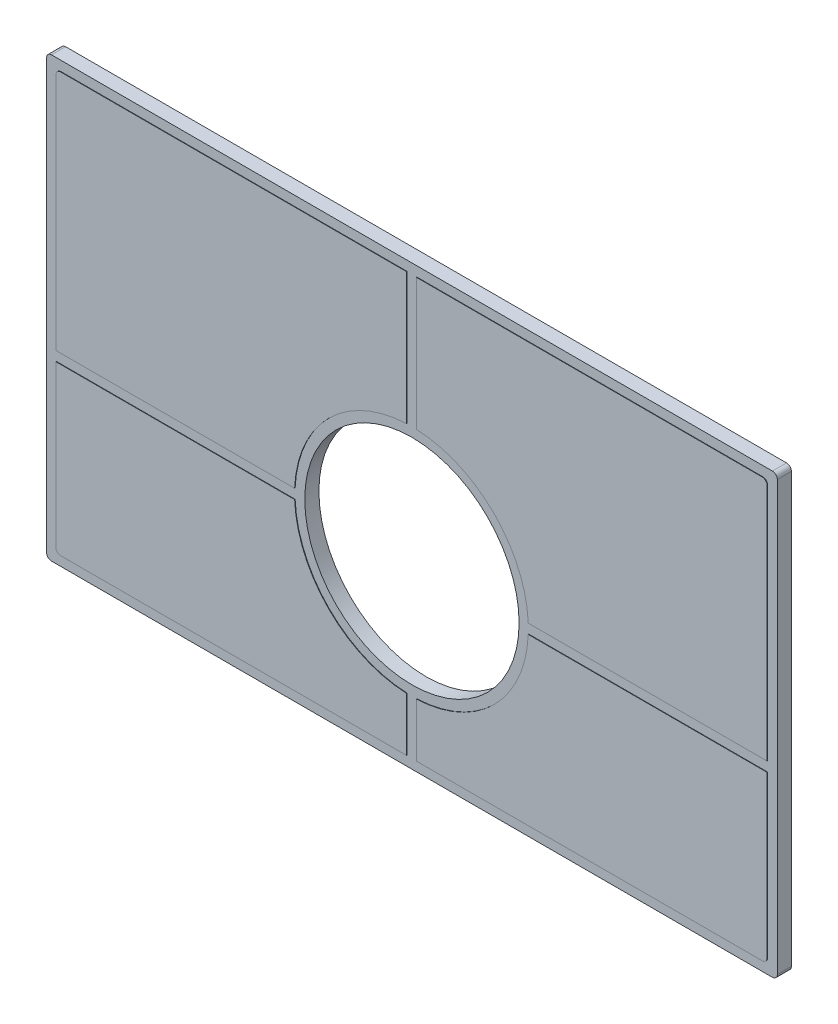
ISO-10303-21;
HEADER;
FILE_DESCRIPTION(('STEP AP214'),'2;1');
FILE_NAME('part.step','',(''),(''),'','','');
FILE_SCHEMA(('AUTOMOTIVE_DESIGN { 1 0 10303 214 1 1 1 1 }'));
ENDSEC;
DATA;
#1=APPLICATION_CONTEXT('core data for automotive mechanical design processes');
#2=APPLICATION_PROTOCOL_DEFINITION('international standard','automotive_design',2000,#1);
#3=PRODUCT_CONTEXT('',#1,'mechanical');
#4=PRODUCT('Part','Part','',(#3));
#5=PRODUCT_RELATED_PRODUCT_CATEGORY('part','',(#4));
#6=PRODUCT_DEFINITION_FORMATION('','',#4);
#7=PRODUCT_DEFINITION_CONTEXT('part definition',#1,'design');
#8=PRODUCT_DEFINITION('design','',#6,#7);
#9=PRODUCT_DEFINITION_SHAPE('','',#8);
#10=(LENGTH_UNIT() NAMED_UNIT(*) SI_UNIT(.MILLI.,.METRE.));
#11=(NAMED_UNIT(*) PLANE_ANGLE_UNIT() SI_UNIT($,.RADIAN.));
#12=(NAMED_UNIT(*) SI_UNIT($,.STERADIAN.) SOLID_ANGLE_UNIT());
#13=UNCERTAINTY_MEASURE_WITH_UNIT(LENGTH_MEASURE(1.E-05),#10,'distance_accuracy_value','');
#14=(GEOMETRIC_REPRESENTATION_CONTEXT(3) GLOBAL_UNCERTAINTY_ASSIGNED_CONTEXT((#13)) GLOBAL_UNIT_ASSIGNED_CONTEXT((#10,
#11,#12)) REPRESENTATION_CONTEXT('',''));
#15=CARTESIAN_POINT('',(0.,0.,0.));
#16=DIRECTION('',(0.,0.,1.));
#17=DIRECTION('',(1.,0.,0.));
#18=AXIS2_PLACEMENT_3D('',#15,#16,#17);
#19=CARTESIAN_POINT('',(74.,52.,3.));
#20=DIRECTION('',(0.,0.,-1.));
#21=DIRECTION('',(-1.,0.,0.));
#22=AXIS2_PLACEMENT_3D('',#19,#20,#21);
#23=PLANE('',#22);
#24=DIRECTION('',(0.,-1.,0.));
#25=VECTOR('',#24,1.);
#26=CARTESIAN_POINT('',(-73.,50.,3.));
#27=LINE('',#26,#25);
#28=CARTESIAN_POINT('',(-73.,50.,3.));
#29=VERTEX_POINT('',#28);
#30=CARTESIAN_POINT('',(-73.,0.999999999999999,3.));
#31=VERTEX_POINT('',#30);
#32=EDGE_CURVE('E271',#29,#31,#27,.T.);
#33=ORIENTED_EDGE('',*,*,#32,.T.);
#34=DIRECTION('',(-1.,0.,0.));
#35=VECTOR('',#34,1.);
#36=CARTESIAN_POINT('',(-85.9969080912694,0.999999999999999,3.));
#37=LINE('',#36,#35);
#38=CARTESIAN_POINT('',(-23.9791576165636,0.999999999999999,3.));
#39=VERTEX_POINT('',#38);
#40=EDGE_CURVE('E264',#39,#31,#37,.T.);
#41=ORIENTED_EDGE('',*,*,#40,.F.);
#42=CARTESIAN_POINT('',(0.,0.,3.));
#43=DIRECTION('',(0.,0.,1.));
#44=DIRECTION('',(1.,0.,0.));
#45=AXIS2_PLACEMENT_3D('',#42,#43,#44);
#46=CIRCLE('',#45,24.);
#47=CARTESIAN_POINT('',(-1.00000000000001,23.9791576165636,3.));
#48=VERTEX_POINT('',#47);
#49=EDGE_CURVE('E336',#48,#39,#46,.T.);
#50=ORIENTED_EDGE('',*,*,#49,.F.);
#51=DIRECTION('',(0.,-1.,0.));
#52=VECTOR('',#51,1.);
#53=CARTESIAN_POINT('',(-1.00000000000002,55.9780544222432,3.));
#54=LINE('',#53,#52);
#55=CARTESIAN_POINT('',(-1.00000000000001,51.,3.));
#56=VERTEX_POINT('',#55);
#57=EDGE_CURVE('E392',#56,#48,#54,.T.);
#58=ORIENTED_EDGE('',*,*,#57,.F.);
#59=DIRECTION('',(-1.,0.,0.));
#60=VECTOR('',#59,1.);
#61=CARTESIAN_POINT('',(72.,51.,3.));
#62=LINE('',#61,#60);
#63=CARTESIAN_POINT('',(-72.,51.,3.));
#64=VERTEX_POINT('',#63);
#65=EDGE_CURVE('E401',#56,#64,#62,.T.);
#66=ORIENTED_EDGE('',*,*,#65,.T.);
#67=CARTESIAN_POINT('',(-72.,50.,3.));
#68=DIRECTION('',(0.,0.,1.));
#69=DIRECTION('',(1.,0.,0.));
#70=AXIS2_PLACEMENT_3D('',#67,#68,#69);
#71=CIRCLE('',#70,1.);
#72=EDGE_CURVE('E272',#64,#29,#71,.T.);
#73=ORIENTED_EDGE('',*,*,#72,.T.);
#74=EDGE_LOOP('',(#33,#41,#50,#58,#66,#73));
#75=FACE_BOUND('',#74,.T.);
#76=ADVANCED_FACE('F37',(#75),#23,.F.);
#77=CARTESIAN_POINT('',(0.,0.,2.9));
#78=DIRECTION('',(0.,0.,1.));
#79=DIRECTION('',(1.,0.,0.));
#80=AXIS2_PLACEMENT_3D('',#77,#78,#79);
#81=CYLINDRICAL_SURFACE('',#80,24.);
#82=ORIENTED_EDGE('',*,*,#49,.T.);
#83=DIRECTION('',(0.,0.,1.));
#84=VECTOR('',#83,1.);
#85=CARTESIAN_POINT('',(-23.9791576165636,0.999999999999999,2.9));
#86=LINE('',#85,#84);
#87=CARTESIAN_POINT('',(-23.9791576165636,0.999999999999999,2.9));
#88=VERTEX_POINT('',#87);
#89=EDGE_CURVE('E460',#39,#88,#86,.F.);
#90=ORIENTED_EDGE('',*,*,#89,.T.);
#91=CARTESIAN_POINT('',(0.,0.,2.9));
#92=DIRECTION('',(0.,0.,1.));
#93=DIRECTION('',(1.,0.,0.));
#94=AXIS2_PLACEMENT_3D('',#91,#92,#93);
#95=CIRCLE('',#94,24.);
#96=CARTESIAN_POINT('',(-1.00000000000001,23.9791576165636,2.9));
#97=VERTEX_POINT('',#96);
#98=EDGE_CURVE('E332',#97,#88,#95,.T.);
#99=ORIENTED_EDGE('',*,*,#98,.F.);
#100=DIRECTION('',(0.,0.,1.));
#101=VECTOR('',#100,1.);
#102=CARTESIAN_POINT('',(-1.00000000000001,23.9791576165636,2.9));
#103=LINE('',#102,#101);
#104=EDGE_CURVE('E444',#97,#48,#103,.T.);
#105=ORIENTED_EDGE('',*,*,#104,.T.);
#106=EDGE_LOOP('',(#82,#90,#99,#105));
#107=FACE_BOUND('',#106,.T.);
#108=ADVANCED_FACE('F531',(#107),#81,.F.);
#109=CARTESIAN_POINT('',(23.9791576165636,0.999999999999999,3.));
#110=VERTEX_POINT('',#109);
#111=CARTESIAN_POINT('',(1.,23.9791576165636,3.));
#112=VERTEX_POINT('',#111);
#113=EDGE_CURVE('E327',#110,#112,#46,.T.);
#114=ORIENTED_EDGE('',*,*,#113,.F.);
#115=CARTESIAN_POINT('',(72.9999999999999,0.999999999999999,3.));
#116=VERTEX_POINT('',#115);
#117=EDGE_CURVE('E480',#116,#110,#37,.T.);
#118=ORIENTED_EDGE('',*,*,#117,.F.);
#119=DIRECTION('',(0.,1.,0.));
#120=VECTOR('',#119,1.);
#121=CARTESIAN_POINT('',(73.,-34.,3.));
#122=LINE('',#121,#120);
#123=CARTESIAN_POINT('',(73.,50.,3.));
#124=VERTEX_POINT('',#123);
#125=EDGE_CURVE('E289',#116,#124,#122,.T.);
#126=ORIENTED_EDGE('',*,*,#125,.T.);
#127=CARTESIAN_POINT('',(72.,50.,3.));
#128=DIRECTION('',(0.,0.,1.));
#129=DIRECTION('',(-1.,0.,0.));
#130=AXIS2_PLACEMENT_3D('',#127,#128,#129);
#131=CIRCLE('',#130,1.);
#132=CARTESIAN_POINT('',(72.,51.,3.));
#133=VERTEX_POINT('',#132);
#134=EDGE_CURVE('E410',#124,#133,#131,.T.);
#135=ORIENTED_EDGE('',*,*,#134,.T.);
#136=CARTESIAN_POINT('',(1.,51.,3.));
#137=VERTEX_POINT('',#136);
#138=EDGE_CURVE('E277',#133,#137,#62,.T.);
#139=ORIENTED_EDGE('',*,*,#138,.T.);
#140=DIRECTION('',(0.,1.,0.));
#141=VECTOR('',#140,1.);
#142=CARTESIAN_POINT('',(1.,55.9780544222432,3.));
#143=LINE('',#142,#141);
#144=EDGE_CURVE('E405',#112,#137,#143,.T.);
#145=ORIENTED_EDGE('',*,*,#144,.F.);
#146=EDGE_LOOP('',(#114,#118,#126,#135,#139,#145));
#147=FACE_BOUND('',#146,.T.);
#148=ADVANCED_FACE('F496',(#147),#23,.F.);
#149=CARTESIAN_POINT('',(23.9791576165636,0.999999999999999,2.9));
#150=VERTEX_POINT('',#149);
#151=CARTESIAN_POINT('',(1.,23.9791576165636,2.9));
#152=VERTEX_POINT('',#151);
#153=EDGE_CURVE('E331',#150,#152,#95,.T.);
#154=ORIENTED_EDGE('',*,*,#153,.F.);
#155=DIRECTION('',(0.,0.,1.));
#156=VECTOR('',#155,1.);
#157=CARTESIAN_POINT('',(23.9791576165636,0.999999999999999,2.9));
#158=LINE('',#157,#156);
#159=EDGE_CURVE('E467',#150,#110,#158,.T.);
#160=ORIENTED_EDGE('',*,*,#159,.T.);
#161=ORIENTED_EDGE('',*,*,#113,.T.);
#162=DIRECTION('',(0.,0.,1.));
#163=VECTOR('',#162,1.);
#164=CARTESIAN_POINT('',(1.,23.9791576165636,2.9));
#165=LINE('',#164,#163);
#166=EDGE_CURVE('E449',#112,#152,#165,.F.);
#167=ORIENTED_EDGE('',*,*,#166,.T.);
#168=EDGE_LOOP('',(#154,#160,#161,#167));
#169=FACE_BOUND('',#168,.T.);
#170=ADVANCED_FACE('F493',(#169),#81,.F.);
#171=CARTESIAN_POINT('',(73.,-34.,2.9));
#172=DIRECTION('',(1.,0.,0.));
#173=DIRECTION('',(0.,0.,-1.));
#174=AXIS2_PLACEMENT_3D('',#171,#172,#173);
#175=PLANE('',#174);
#176=DIRECTION('',(0.,0.,1.));
#177=VECTOR('',#176,1.);
#178=CARTESIAN_POINT('',(73.,1.,2.9));
#179=LINE('',#178,#177);
#180=CARTESIAN_POINT('',(72.9999999999999,0.999999999999999,2.9));
#181=VERTEX_POINT('',#180);
#182=EDGE_CURVE('E470',#181,#116,#179,.T.);
#183=ORIENTED_EDGE('',*,*,#182,.F.);
#184=DIRECTION('',(0.,1.,0.));
#185=VECTOR('',#184,1.);
#186=CARTESIAN_POINT('',(73.,-34.,2.9));
#187=LINE('',#186,#185);
#188=CARTESIAN_POINT('',(73.,50.,2.9));
#189=VERTEX_POINT('',#188);
#190=EDGE_CURVE('E418',#181,#189,#187,.T.);
#191=ORIENTED_EDGE('',*,*,#190,.T.);
#192=DIRECTION('',(0.,0.,1.));
#193=VECTOR('',#192,1.);
#194=CARTESIAN_POINT('',(73.,50.,2.9));
#195=LINE('',#194,#193);
#196=EDGE_CURVE('E294',#189,#124,#195,.T.);
#197=ORIENTED_EDGE('',*,*,#196,.T.);
#198=ORIENTED_EDGE('',*,*,#125,.F.);
#199=EDGE_LOOP('',(#183,#191,#197,#198));
#200=FACE_BOUND('',#199,.T.);
#201=ADVANCED_FACE('F560',(#200),#175,.T.);
#202=CARTESIAN_POINT('',(-73.,50.,2.9));
#203=DIRECTION('',(-1.,0.,0.));
#204=DIRECTION('',(0.,-1.,0.));
#205=AXIS2_PLACEMENT_3D('',#202,#203,#204);
#206=PLANE('',#205);
#207=DIRECTION('',(0.,0.,-1.));
#208=VECTOR('',#207,1.);
#209=CARTESIAN_POINT('',(-73.,1.,2.9));
#210=LINE('',#209,#208);
#211=CARTESIAN_POINT('',(-73.,1.,2.9));
#212=VERTEX_POINT('',#211);
#213=EDGE_CURVE('E11',#31,#212,#210,.T.);
#214=ORIENTED_EDGE('',*,*,#213,.F.);
#215=ORIENTED_EDGE('',*,*,#32,.F.);
#216=DIRECTION('',(0.,0.,1.));
#217=VECTOR('',#216,1.);
#218=CARTESIAN_POINT('',(-73.,50.,2.9));
#219=LINE('',#218,#217);
#220=CARTESIAN_POINT('',(-73.,50.,2.9));
#221=VERTEX_POINT('',#220);
#222=EDGE_CURVE('E306',#221,#29,#219,.T.);
#223=ORIENTED_EDGE('',*,*,#222,.F.);
#224=DIRECTION('',(0.,-1.,0.));
#225=VECTOR('',#224,1.);
#226=CARTESIAN_POINT('',(-73.,50.,2.9));
#227=LINE('',#226,#225);
#228=EDGE_CURVE('E429',#221,#212,#227,.T.);
#229=ORIENTED_EDGE('',*,*,#228,.T.);
#230=EDGE_LOOP('',(#214,#215,#223,#229));
#231=FACE_BOUND('',#230,.T.);
#232=ADVANCED_FACE('F525',(#231),#206,.T.);
#233=CARTESIAN_POINT('',(-23.9791576165636,-0.999999999999999,3.));
#234=VERTEX_POINT('',#233);
#235=CARTESIAN_POINT('',(-0.999999999999999,-23.9791576165636,3.));
#236=VERTEX_POINT('',#235);
#237=EDGE_CURVE('E263',#234,#236,#46,.T.);
#238=ORIENTED_EDGE('',*,*,#237,.F.);
#239=DIRECTION('',(1.,0.,0.));
#240=VECTOR('',#239,1.);
#241=CARTESIAN_POINT('',(-85.9969080912694,-0.999999999999999,3.));
#242=LINE('',#241,#240);
#243=CARTESIAN_POINT('',(-73.,-0.999999999999999,3.));
#244=VERTEX_POINT('',#243);
#245=EDGE_CURVE('E248',#244,#234,#242,.T.);
#246=ORIENTED_EDGE('',*,*,#245,.F.);
#247=CARTESIAN_POINT('',(-73.,-34.,3.));
#248=VERTEX_POINT('',#247);
#249=EDGE_CURVE('E260',#244,#248,#27,.T.);
#250=ORIENTED_EDGE('',*,*,#249,.T.);
#251=CARTESIAN_POINT('',(-72.,-34.,3.));
#252=DIRECTION('',(0.,0.,1.));
#253=DIRECTION('',(1.,0.,0.));
#254=AXIS2_PLACEMENT_3D('',#251,#252,#253);
#255=CIRCLE('',#254,1.);
#256=CARTESIAN_POINT('',(-72.,-35.,3.));
#257=VERTEX_POINT('',#256);
#258=EDGE_CURVE('E275',#248,#257,#255,.T.);
#259=ORIENTED_EDGE('',*,*,#258,.T.);
#260=DIRECTION('',(1.,0.,0.));
#261=VECTOR('',#260,1.);
#262=CARTESIAN_POINT('',(-72.,-35.,3.));
#263=LINE('',#262,#261);
#264=CARTESIAN_POINT('',(-0.999999999999997,-35.,3.));
#265=VERTEX_POINT('',#264);
#266=EDGE_CURVE('E283',#257,#265,#263,.T.);
#267=ORIENTED_EDGE('',*,*,#266,.T.);
#268=EDGE_CURVE('E406',#236,#265,#54,.T.);
#269=ORIENTED_EDGE('',*,*,#268,.F.);
#270=EDGE_LOOP('',(#238,#246,#250,#259,#267,#269));
#271=FACE_BOUND('',#270,.T.);
#272=ADVANCED_FACE('F258',(#271),#23,.F.);
#273=CARTESIAN_POINT('',(-23.9791576165636,-0.999999999999999,2.9));
#274=VERTEX_POINT('',#273);
#275=CARTESIAN_POINT('',(-0.999999999999999,-23.9791576165636,2.9));
#276=VERTEX_POINT('',#275);
#277=EDGE_CURVE('E330',#274,#276,#95,.T.);
#278=ORIENTED_EDGE('',*,*,#277,.F.);
#279=DIRECTION('',(0.,0.,1.));
#280=VECTOR('',#279,1.);
#281=CARTESIAN_POINT('',(-23.9791576165636,-0.999999999999999,2.9));
#282=LINE('',#281,#280);
#283=EDGE_CURVE('E472',#274,#234,#282,.T.);
#284=ORIENTED_EDGE('',*,*,#283,.T.);
#285=ORIENTED_EDGE('',*,*,#237,.T.);
#286=DIRECTION('',(0.,0.,1.));
#287=VECTOR('',#286,1.);
#288=CARTESIAN_POINT('',(-0.999999999999999,-23.9791576165636,2.9));
#289=LINE('',#288,#287);
#290=EDGE_CURVE('E413',#236,#276,#289,.F.);
#291=ORIENTED_EDGE('',*,*,#290,.T.);
#292=EDGE_LOOP('',(#278,#284,#285,#291));
#293=FACE_BOUND('',#292,.T.);
#294=ADVANCED_FACE('F500',(#293),#81,.F.);
#295=CARTESIAN_POINT('',(-72.,-35.,2.9));
#296=DIRECTION('',(0.,-1.,0.));
#297=DIRECTION('',(0.,0.,-1.));
#298=AXIS2_PLACEMENT_3D('',#295,#296,#297);
#299=PLANE('',#298);
#300=DIRECTION('',(0.,0.,-1.));
#301=VECTOR('',#300,1.);
#302=CARTESIAN_POINT('',(-1.,-35.,2.9));
#303=LINE('',#302,#301);
#304=CARTESIAN_POINT('',(-1.00000000000001,-35.,2.9));
#305=VERTEX_POINT('',#304);
#306=EDGE_CURVE('E446',#265,#305,#303,.T.);
#307=ORIENTED_EDGE('',*,*,#306,.F.);
#308=ORIENTED_EDGE('',*,*,#266,.F.);
#309=DIRECTION('',(0.,0.,1.));
#310=VECTOR('',#309,1.);
#311=CARTESIAN_POINT('',(-72.,-35.,2.9));
#312=LINE('',#311,#310);
#313=CARTESIAN_POINT('',(-72.,-35.,2.9));
#314=VERTEX_POINT('',#313);
#315=EDGE_CURVE('E303',#314,#257,#312,.T.);
#316=ORIENTED_EDGE('',*,*,#315,.F.);
#317=DIRECTION('',(1.,0.,0.));
#318=VECTOR('',#317,1.);
#319=CARTESIAN_POINT('',(-72.,-35.,2.9));
#320=LINE('',#319,#318);
#321=EDGE_CURVE('E422',#314,#305,#320,.T.);
#322=ORIENTED_EDGE('',*,*,#321,.T.);
#323=EDGE_LOOP('',(#307,#308,#316,#322));
#324=FACE_BOUND('',#323,.T.);
#325=ADVANCED_FACE('F507',(#324),#299,.T.);
#326=CARTESIAN_POINT('',(72.,51.,2.9));
#327=DIRECTION('',(0.,1.,0.));
#328=DIRECTION('',(-1.,0.,0.));
#329=AXIS2_PLACEMENT_3D('',#326,#327,#328);
#330=PLANE('',#329);
#331=DIRECTION('',(0.,0.,1.));
#332=VECTOR('',#331,1.);
#333=CARTESIAN_POINT('',(-1.00000000000001,51.,2.9));
#334=LINE('',#333,#332);
#335=CARTESIAN_POINT('',(-1.00000000000001,51.,2.9));
#336=VERTEX_POINT('',#335);
#337=EDGE_CURVE('E255',#336,#56,#334,.T.);
#338=ORIENTED_EDGE('',*,*,#337,.F.);
#339=DIRECTION('',(-1.,0.,0.));
#340=VECTOR('',#339,1.);
#341=CARTESIAN_POINT('',(72.,51.,2.9));
#342=LINE('',#341,#340);
#343=CARTESIAN_POINT('',(-72.,51.,2.9));
#344=VERTEX_POINT('',#343);
#345=EDGE_CURVE('E439',#336,#344,#342,.T.);
#346=ORIENTED_EDGE('',*,*,#345,.T.);
#347=DIRECTION('',(0.,0.,1.));
#348=VECTOR('',#347,1.);
#349=CARTESIAN_POINT('',(-72.,51.,2.9));
#350=LINE('',#349,#348);
#351=EDGE_CURVE('E308',#344,#64,#350,.T.);
#352=ORIENTED_EDGE('',*,*,#351,.T.);
#353=ORIENTED_EDGE('',*,*,#65,.F.);
#354=EDGE_LOOP('',(#338,#346,#352,#353));
#355=FACE_BOUND('',#354,.T.);
#356=ADVANCED_FACE('F408',(#355),#330,.T.);
#357=CARTESIAN_POINT('',(73.,-34.,3.));
#358=VERTEX_POINT('',#357);
#359=CARTESIAN_POINT('',(72.9999999999999,-0.999999999999999,3.));
#360=VERTEX_POINT('',#359);
#361=EDGE_CURVE('E290',#358,#360,#122,.T.);
#362=ORIENTED_EDGE('',*,*,#361,.T.);
#363=CARTESIAN_POINT('',(23.9791576165636,-0.999999999999999,3.));
#364=VERTEX_POINT('',#363);
#365=EDGE_CURVE('E265',#364,#360,#242,.T.);
#366=ORIENTED_EDGE('',*,*,#365,.F.);
#367=CARTESIAN_POINT('',(1.,-23.9791576165636,3.));
#368=VERTEX_POINT('',#367);
#369=EDGE_CURVE('E333',#368,#364,#46,.T.);
#370=ORIENTED_EDGE('',*,*,#369,.F.);
#371=CARTESIAN_POINT('',(1.00000000000001,-35.,3.));
#372=VERTEX_POINT('',#371);
#373=EDGE_CURVE('E458',#372,#368,#143,.T.);
#374=ORIENTED_EDGE('',*,*,#373,.F.);
#375=CARTESIAN_POINT('',(72.,-35.,3.));
#376=VERTEX_POINT('',#375);
#377=EDGE_CURVE('E282',#372,#376,#263,.T.);
#378=ORIENTED_EDGE('',*,*,#377,.T.);
#379=CARTESIAN_POINT('',(72.,-34.,3.));
#380=DIRECTION('',(0.,0.,1.));
#381=DIRECTION('',(1.,0.,0.));
#382=AXIS2_PLACEMENT_3D('',#379,#380,#381);
#383=CIRCLE('',#382,1.);
#384=EDGE_CURVE('E286',#376,#358,#383,.T.);
#385=ORIENTED_EDGE('',*,*,#384,.T.);
#386=EDGE_LOOP('',(#362,#366,#370,#374,#378,#385));
#387=FACE_BOUND('',#386,.T.);
#388=ADVANCED_FACE('F533',(#387),#23,.F.);
#389=CARTESIAN_POINT('',(74.,52.,3.));
#390=DIRECTION('',(0.,0.,-1.));
#391=DIRECTION('',(-1.,0.,0.));
#392=AXIS2_PLACEMENT_3D('',#389,#390,#391);
#393=CYLINDRICAL_SURFACE('',#392,1.);
#394=CARTESIAN_POINT('',(74.,52.,2.9));
#395=DIRECTION('',(0.,0.,1.));
#396=DIRECTION('',(1.,0.,0.));
#397=AXIS2_PLACEMENT_3D('',#394,#395,#396);
#398=CIRCLE('',#397,1.);
#399=CARTESIAN_POINT('',(75.,52.,2.9));
#400=VERTEX_POINT('',#399);
#401=CARTESIAN_POINT('',(74.,53.,2.9));
#402=VERTEX_POINT('',#401);
#403=EDGE_CURVE('E325',#400,#402,#398,.T.);
#404=ORIENTED_EDGE('',*,*,#403,.F.);
#405=DIRECTION('',(0.,0.,-1.));
#406=VECTOR('',#405,1.);
#407=CARTESIAN_POINT('',(75.,52.,3.));
#408=LINE('',#407,#406);
#409=CARTESIAN_POINT('',(75.,52.,0.));
#410=VERTEX_POINT('',#409);
#411=EDGE_CURVE('E365',#400,#410,#408,.T.);
#412=ORIENTED_EDGE('',*,*,#411,.T.);
#413=CARTESIAN_POINT('',(74.,52.,0.));
#414=DIRECTION('',(0.,0.,1.));
#415=DIRECTION('',(-1.,0.,0.));
#416=AXIS2_PLACEMENT_3D('',#413,#414,#415);
#417=CIRCLE('',#416,1.);
#418=CARTESIAN_POINT('',(74.,53.,0.));
#419=VERTEX_POINT('',#418);
#420=EDGE_CURVE('E340',#410,#419,#417,.T.);
#421=ORIENTED_EDGE('',*,*,#420,.T.);
#422=DIRECTION('',(0.,0.,-1.));
#423=VECTOR('',#422,1.);
#424=CARTESIAN_POINT('',(74.,53.,3.));
#425=LINE('',#424,#423);
#426=EDGE_CURVE('E379',#402,#419,#425,.T.);
#427=ORIENTED_EDGE('',*,*,#426,.F.);
#428=EDGE_LOOP('',(#404,#412,#421,#427));
#429=FACE_BOUND('',#428,.T.);
#430=ADVANCED_FACE('F39',(#429),#393,.T.);
#431=CARTESIAN_POINT('',(-74.,53.,3.));
#432=DIRECTION('',(0.,-1.,0.));
#433=DIRECTION('',(1.,0.,0.));
#434=AXIS2_PLACEMENT_3D('',#431,#432,#433);
#435=PLANE('',#434);
#436=DIRECTION('',(-1.,0.,0.));
#437=VECTOR('',#436,1.);
#438=CARTESIAN_POINT('',(-74.,53.,2.9));
#439=LINE('',#438,#437);
#440=CARTESIAN_POINT('',(-74.,53.,2.9));
#441=VERTEX_POINT('',#440);
#442=EDGE_CURVE('E323',#402,#441,#439,.T.);
#443=ORIENTED_EDGE('',*,*,#442,.F.);
#444=ORIENTED_EDGE('',*,*,#426,.T.);
#445=DIRECTION('',(-1.,0.,0.));
#446=VECTOR('',#445,1.);
#447=CARTESIAN_POINT('',(-74.,53.,0.));
#448=LINE('',#447,#446);
#449=CARTESIAN_POINT('',(-74.,53.,0.));
#450=VERTEX_POINT('',#449);
#451=EDGE_CURVE('E344',#419,#450,#448,.T.);
#452=ORIENTED_EDGE('',*,*,#451,.T.);
#453=DIRECTION('',(0.,0.,-1.));
#454=VECTOR('',#453,1.);
#455=CARTESIAN_POINT('',(-74.,53.,3.));
#456=LINE('',#455,#454);
#457=EDGE_CURVE('E377',#441,#450,#456,.T.);
#458=ORIENTED_EDGE('',*,*,#457,.F.);
#459=EDGE_LOOP('',(#443,#444,#452,#458));
#460=FACE_BOUND('',#459,.T.);
#461=ADVANCED_FACE('F551',(#460),#435,.F.);
#462=CARTESIAN_POINT('',(-74.,52.,3.));
#463=DIRECTION('',(0.,0.,-1.));
#464=DIRECTION('',(-1.,0.,0.));
#465=AXIS2_PLACEMENT_3D('',#462,#463,#464);
#466=CYLINDRICAL_SURFACE('',#465,1.);
#467=CARTESIAN_POINT('',(-74.,52.,2.9));
#468=DIRECTION('',(0.,0.,1.));
#469=DIRECTION('',(1.,0.,0.));
#470=AXIS2_PLACEMENT_3D('',#467,#468,#469);
#471=CIRCLE('',#470,1.);
#472=CARTESIAN_POINT('',(-75.,52.,2.9));
#473=VERTEX_POINT('',#472);
#474=EDGE_CURVE('E321',#441,#473,#471,.T.);
#475=ORIENTED_EDGE('',*,*,#474,.F.);
#476=ORIENTED_EDGE('',*,*,#457,.T.);
#477=CARTESIAN_POINT('',(-74.,52.,0.));
#478=DIRECTION('',(0.,0.,1.));
#479=DIRECTION('',(1.,0.,0.));
#480=AXIS2_PLACEMENT_3D('',#477,#478,#479);
#481=CIRCLE('',#480,1.);
#482=CARTESIAN_POINT('',(-75.,52.,0.));
#483=VERTEX_POINT('',#482);
#484=EDGE_CURVE('E347',#450,#483,#481,.T.);
#485=ORIENTED_EDGE('',*,*,#484,.T.);
#486=DIRECTION('',(0.,0.,-1.));
#487=VECTOR('',#486,1.);
#488=CARTESIAN_POINT('',(-75.,52.,3.));
#489=LINE('',#488,#487);
#490=EDGE_CURVE('E375',#473,#483,#489,.T.);
#491=ORIENTED_EDGE('',*,*,#490,.F.);
#492=EDGE_LOOP('',(#475,#476,#485,#491));
#493=FACE_BOUND('',#492,.T.);
#494=ADVANCED_FACE('F618',(#493),#466,.T.);
#495=CARTESIAN_POINT('',(-75.,52.,3.));
#496=DIRECTION('',(1.,0.,0.));
#497=DIRECTION('',(0.,1.,0.));
#498=AXIS2_PLACEMENT_3D('',#495,#496,#497);
#499=PLANE('',#498);
#500=DIRECTION('',(0.,-1.,0.));
#501=VECTOR('',#500,1.);
#502=CARTESIAN_POINT('',(-75.,52.,2.9));
#503=LINE('',#502,#501);
#504=CARTESIAN_POINT('',(-75.,-36.,2.9));
#505=VERTEX_POINT('',#504);
#506=EDGE_CURVE('E319',#473,#505,#503,.T.);
#507=ORIENTED_EDGE('',*,*,#506,.F.);
#508=ORIENTED_EDGE('',*,*,#490,.T.);
#509=DIRECTION('',(0.,-1.,0.));
#510=VECTOR('',#509,1.);
#511=CARTESIAN_POINT('',(-75.,52.,0.));
#512=LINE('',#511,#510);
#513=CARTESIAN_POINT('',(-75.,-36.,0.));
#514=VERTEX_POINT('',#513);
#515=EDGE_CURVE('E350',#483,#514,#512,.T.);
#516=ORIENTED_EDGE('',*,*,#515,.T.);
#517=DIRECTION('',(0.,0.,-1.));
#518=VECTOR('',#517,1.);
#519=CARTESIAN_POINT('',(-75.,-36.,3.));
#520=LINE('',#519,#518);
#521=EDGE_CURVE('E373',#505,#514,#520,.T.);
#522=ORIENTED_EDGE('',*,*,#521,.F.);
#523=EDGE_LOOP('',(#507,#508,#516,#522));
#524=FACE_BOUND('',#523,.T.);
#525=ADVANCED_FACE('F615',(#524),#499,.F.);
#526=CARTESIAN_POINT('',(-74.,-36.,3.));
#527=DIRECTION('',(0.,0.,-1.));
#528=DIRECTION('',(-1.,0.,0.));
#529=AXIS2_PLACEMENT_3D('',#526,#527,#528);
#530=CYLINDRICAL_SURFACE('',#529,1.);
#531=CARTESIAN_POINT('',(-74.,-36.,2.9));
#532=DIRECTION('',(0.,0.,1.));
#533=DIRECTION('',(1.,0.,0.));
#534=AXIS2_PLACEMENT_3D('',#531,#532,#533);
#535=CIRCLE('',#534,1.);
#536=CARTESIAN_POINT('',(-74.,-37.,2.9));
#537=VERTEX_POINT('',#536);
#538=EDGE_CURVE('E317',#505,#537,#535,.T.);
#539=ORIENTED_EDGE('',*,*,#538,.F.);
#540=ORIENTED_EDGE('',*,*,#521,.T.);
#541=CARTESIAN_POINT('',(-74.,-36.,0.));
#542=DIRECTION('',(0.,0.,1.));
#543=DIRECTION('',(1.,0.,0.));
#544=AXIS2_PLACEMENT_3D('',#541,#542,#543);
#545=CIRCLE('',#544,1.);
#546=CARTESIAN_POINT('',(-74.,-37.,0.));
#547=VERTEX_POINT('',#546);
#548=EDGE_CURVE('E353',#514,#547,#545,.T.);
#549=ORIENTED_EDGE('',*,*,#548,.T.);
#550=DIRECTION('',(0.,0.,-1.));
#551=VECTOR('',#550,1.);
#552=CARTESIAN_POINT('',(-74.,-37.,3.));
#553=LINE('',#552,#551);
#554=EDGE_CURVE('E371',#537,#547,#553,.T.);
#555=ORIENTED_EDGE('',*,*,#554,.F.);
#556=EDGE_LOOP('',(#539,#540,#549,#555));
#557=FACE_BOUND('',#556,.T.);
#558=ADVANCED_FACE('F611',(#557),#530,.T.);
#559=CARTESIAN_POINT('',(-74.,-37.,3.));
#560=DIRECTION('',(0.,1.,0.));
#561=DIRECTION('',(0.,0.,1.));
#562=AXIS2_PLACEMENT_3D('',#559,#560,#561);
#563=PLANE('',#562);
#564=DIRECTION('',(1.,0.,0.));
#565=VECTOR('',#564,1.);
#566=CARTESIAN_POINT('',(-74.,-37.,2.9));
#567=LINE('',#566,#565);
#568=CARTESIAN_POINT('',(74.,-37.,2.9));
#569=VERTEX_POINT('',#568);
#570=EDGE_CURVE('E315',#537,#569,#567,.T.);
#571=ORIENTED_EDGE('',*,*,#570,.F.);
#572=ORIENTED_EDGE('',*,*,#554,.T.);
#573=DIRECTION('',(1.,0.,0.));
#574=VECTOR('',#573,1.);
#575=CARTESIAN_POINT('',(-74.,-37.,0.));
#576=LINE('',#575,#574);
#577=CARTESIAN_POINT('',(74.,-37.,0.));
#578=VERTEX_POINT('',#577);
#579=EDGE_CURVE('E356',#547,#578,#576,.T.);
#580=ORIENTED_EDGE('',*,*,#579,.T.);
#581=DIRECTION('',(0.,0.,-1.));
#582=VECTOR('',#581,1.);
#583=CARTESIAN_POINT('',(74.,-37.,3.));
#584=LINE('',#583,#582);
#585=EDGE_CURVE('E369',#569,#578,#584,.T.);
#586=ORIENTED_EDGE('',*,*,#585,.F.);
#587=EDGE_LOOP('',(#571,#572,#580,#586));
#588=FACE_BOUND('',#587,.T.);
#589=ADVANCED_FACE('F604',(#588),#563,.F.);
#590=CARTESIAN_POINT('',(74.,-36.,3.));
#591=DIRECTION('',(0.,0.,-1.));
#592=DIRECTION('',(-1.,0.,0.));
#593=AXIS2_PLACEMENT_3D('',#590,#591,#592);
#594=CYLINDRICAL_SURFACE('',#593,1.);
#595=CARTESIAN_POINT('',(74.,-36.,2.9));
#596=DIRECTION('',(0.,0.,1.));
#597=DIRECTION('',(1.,0.,0.));
#598=AXIS2_PLACEMENT_3D('',#595,#596,#597);
#599=CIRCLE('',#598,1.);
#600=CARTESIAN_POINT('',(75.,-36.,2.9));
#601=VERTEX_POINT('',#600);
#602=EDGE_CURVE('E297',#569,#601,#599,.T.);
#603=ORIENTED_EDGE('',*,*,#602,.F.);
#604=ORIENTED_EDGE('',*,*,#585,.T.);
#605=CARTESIAN_POINT('',(74.,-36.,0.));
#606=DIRECTION('',(0.,0.,1.));
#607=DIRECTION('',(1.,0.,0.));
#608=AXIS2_PLACEMENT_3D('',#605,#606,#607);
#609=CIRCLE('',#608,1.);
#610=CARTESIAN_POINT('',(75.,-36.,0.));
#611=VERTEX_POINT('',#610);
#612=EDGE_CURVE('E359',#578,#611,#609,.T.);
#613=ORIENTED_EDGE('',*,*,#612,.T.);
#614=DIRECTION('',(0.,0.,-1.));
#615=VECTOR('',#614,1.);
#616=CARTESIAN_POINT('',(75.,-36.,3.));
#617=LINE('',#616,#615);
#618=EDGE_CURVE('E367',#601,#611,#617,.T.);
#619=ORIENTED_EDGE('',*,*,#618,.F.);
#620=EDGE_LOOP('',(#603,#604,#613,#619));
#621=FACE_BOUND('',#620,.T.);
#622=ADVANCED_FACE('F593',(#621),#594,.T.);
#623=CARTESIAN_POINT('',(75.,52.,3.));
#624=DIRECTION('',(-1.,0.,0.));
#625=DIRECTION('',(0.,0.,1.));
#626=AXIS2_PLACEMENT_3D('',#623,#624,#625);
#627=PLANE('',#626);
#628=DIRECTION('',(0.,1.,0.));
#629=VECTOR('',#628,1.);
#630=CARTESIAN_POINT('',(75.,52.,2.9));
#631=LINE('',#630,#629);
#632=EDGE_CURVE('E381',#601,#400,#631,.T.);
#633=ORIENTED_EDGE('',*,*,#632,.F.);
#634=ORIENTED_EDGE('',*,*,#618,.T.);
#635=DIRECTION('',(0.,1.,0.));
#636=VECTOR('',#635,1.);
#637=CARTESIAN_POINT('',(75.,52.,0.));
#638=LINE('',#637,#636);
#639=EDGE_CURVE('E362',#611,#410,#638,.T.);
#640=ORIENTED_EDGE('',*,*,#639,.T.);
#641=ORIENTED_EDGE('',*,*,#411,.F.);
#642=EDGE_LOOP('',(#633,#634,#640,#641));
#643=FACE_BOUND('',#642,.T.);
#644=ADVANCED_FACE('F586',(#643),#627,.F.);
#645=CARTESIAN_POINT('',(0.,0.,3.));
#646=DIRECTION('',(0.,0.,-1.));
#647=DIRECTION('',(-1.,0.,0.));
#648=AXIS2_PLACEMENT_3D('',#645,#646,#647);
#649=CYLINDRICAL_SURFACE('',#648,22.);
#650=CARTESIAN_POINT('',(0.,0.,0.));
#651=DIRECTION('',(0.,0.,1.));
#652=DIRECTION('',(1.,0.,0.));
#653=AXIS2_PLACEMENT_3D('',#650,#651,#652);
#654=CIRCLE('',#653,22.);
#655=CARTESIAN_POINT('',(22.,0.,0.));
#656=VERTEX_POINT('',#655);
#657=EDGE_CURVE('E337',#656,#656,#654,.T.);
#658=ORIENTED_EDGE('',*,*,#657,.F.);
#659=EDGE_LOOP('',(#658));
#660=FACE_BOUND('',#659,.T.);
#661=CARTESIAN_POINT('',(0.,0.,2.9));
#662=DIRECTION('',(0.,0.,1.));
#663=DIRECTION('',(1.,0.,0.));
#664=AXIS2_PLACEMENT_3D('',#661,#662,#663);
#665=CIRCLE('',#664,22.);
#666=CARTESIAN_POINT('',(22.,0.,2.9));
#667=VERTEX_POINT('',#666);
#668=EDGE_CURVE('E341',#667,#667,#665,.T.);
#669=ORIENTED_EDGE('',*,*,#668,.T.);
#670=EDGE_LOOP('',(#669));
#671=FACE_BOUND('',#670,.T.);
#672=ADVANCED_FACE('F584',(#660,#671),#649,.F.);
#673=CARTESIAN_POINT('',(74.,52.,0.));
#674=DIRECTION('',(0.,0.,-1.));
#675=DIRECTION('',(-1.,0.,0.));
#676=AXIS2_PLACEMENT_3D('',#673,#674,#675);
#677=PLANE('',#676);
#678=ORIENTED_EDGE('',*,*,#420,.F.);
#679=ORIENTED_EDGE('',*,*,#639,.F.);
#680=ORIENTED_EDGE('',*,*,#612,.F.);
#681=ORIENTED_EDGE('',*,*,#579,.F.);
#682=ORIENTED_EDGE('',*,*,#548,.F.);
#683=ORIENTED_EDGE('',*,*,#515,.F.);
#684=ORIENTED_EDGE('',*,*,#484,.F.);
#685=ORIENTED_EDGE('',*,*,#451,.F.);
#686=EDGE_LOOP('',(#678,#679,#680,#681,#682,#683,#684,#685));
#687=FACE_BOUND('',#686,.T.);
#688=ORIENTED_EDGE('',*,*,#657,.T.);
#689=EDGE_LOOP('',(#688));
#690=FACE_BOUND('',#689,.T.);
#691=ADVANCED_FACE('F582',(#687,#690),#677,.T.);
#692=ORIENTED_EDGE('',*,*,#369,.T.);
#693=DIRECTION('',(0.,0.,1.));
#694=VECTOR('',#693,1.);
#695=CARTESIAN_POINT('',(23.9791576165636,-0.999999999999999,2.9));
#696=LINE('',#695,#694);
#697=CARTESIAN_POINT('',(23.9791576165636,-0.999999999999999,2.9));
#698=VERTEX_POINT('',#697);
#699=EDGE_CURVE('E474',#364,#698,#696,.F.);
#700=ORIENTED_EDGE('',*,*,#699,.T.);
#701=CARTESIAN_POINT('',(1.,-23.9791576165636,2.9));
#702=VERTEX_POINT('',#701);
#703=EDGE_CURVE('E328',#702,#698,#95,.T.);
#704=ORIENTED_EDGE('',*,*,#703,.F.);
#705=DIRECTION('',(0.,0.,1.));
#706=VECTOR('',#705,1.);
#707=CARTESIAN_POINT('',(1.,-23.9791576165636,2.9));
#708=LINE('',#707,#706);
#709=EDGE_CURVE('E452',#702,#368,#708,.T.);
#710=ORIENTED_EDGE('',*,*,#709,.T.);
#711=EDGE_LOOP('',(#692,#700,#704,#710));
#712=FACE_BOUND('',#711,.T.);
#713=ADVANCED_FACE('F540',(#712),#81,.F.);
#714=CARTESIAN_POINT('',(0.,0.,2.9));
#715=DIRECTION('',(0.,0.,1.));
#716=DIRECTION('',(1.,0.,0.));
#717=AXIS2_PLACEMENT_3D('',#714,#715,#716);
#718=PLANE('',#717);
#719=ORIENTED_EDGE('',*,*,#98,.T.);
#720=DIRECTION('',(-1.,0.,0.));
#721=VECTOR('',#720,1.);
#722=CARTESIAN_POINT('',(-85.9969080912694,0.999999999999999,2.9));
#723=LINE('',#722,#721);
#724=EDGE_CURVE('E60',#88,#212,#723,.T.);
#725=ORIENTED_EDGE('',*,*,#724,.T.);
#726=ORIENTED_EDGE('',*,*,#228,.F.);
#727=CARTESIAN_POINT('',(-72.,50.,2.9));
#728=DIRECTION('',(0.,0.,1.));
#729=DIRECTION('',(1.,0.,0.));
#730=AXIS2_PLACEMENT_3D('',#727,#728,#729);
#731=CIRCLE('',#730,1.);
#732=EDGE_CURVE('E433',#344,#221,#731,.T.);
#733=ORIENTED_EDGE('',*,*,#732,.F.);
#734=ORIENTED_EDGE('',*,*,#345,.F.);
#735=DIRECTION('',(0.,-1.,0.));
#736=VECTOR('',#735,1.);
#737=CARTESIAN_POINT('',(-1.00000000000002,55.9780544222432,2.9));
#738=LINE('',#737,#736);
#739=EDGE_CURVE('E395',#336,#97,#738,.T.);
#740=ORIENTED_EDGE('',*,*,#739,.T.);
#741=EDGE_LOOP('',(#719,#725,#726,#733,#734,#740));
#742=FACE_BOUND('',#741,.T.);
#743=ORIENTED_EDGE('',*,*,#703,.T.);
#744=DIRECTION('',(1.,0.,0.));
#745=VECTOR('',#744,1.);
#746=CARTESIAN_POINT('',(-85.9969080912694,-0.999999999999999,2.9));
#747=LINE('',#746,#745);
#748=CARTESIAN_POINT('',(73.,-1.,2.9));
#749=VERTEX_POINT('',#748);
#750=EDGE_CURVE('E52',#698,#749,#747,.T.);
#751=ORIENTED_EDGE('',*,*,#750,.T.);
#752=CARTESIAN_POINT('',(73.,-34.,2.9));
#753=VERTEX_POINT('',#752);
#754=EDGE_CURVE('E313',#753,#749,#187,.T.);
#755=ORIENTED_EDGE('',*,*,#754,.F.);
#756=CARTESIAN_POINT('',(72.,-34.,2.9));
#757=DIRECTION('',(0.,0.,1.));
#758=DIRECTION('',(1.,0.,0.));
#759=AXIS2_PLACEMENT_3D('',#756,#757,#758);
#760=CIRCLE('',#759,1.);
#761=CARTESIAN_POINT('',(72.,-35.,2.9));
#762=VERTEX_POINT('',#761);
#763=EDGE_CURVE('E419',#762,#753,#760,.T.);
#764=ORIENTED_EDGE('',*,*,#763,.F.);
#765=CARTESIAN_POINT('',(1.00000000000001,-35.,2.9));
#766=VERTEX_POINT('',#765);
#767=EDGE_CURVE('E425',#766,#762,#320,.T.);
#768=ORIENTED_EDGE('',*,*,#767,.F.);
#769=DIRECTION('',(0.,1.,0.));
#770=VECTOR('',#769,1.);
#771=CARTESIAN_POINT('',(1.,55.9780544222432,2.9));
#772=LINE('',#771,#770);
#773=EDGE_CURVE('E457',#766,#702,#772,.T.);
#774=ORIENTED_EDGE('',*,*,#773,.T.);
#775=EDGE_LOOP('',(#743,#751,#755,#764,#768,#774));
#776=FACE_BOUND('',#775,.T.);
#777=ORIENTED_EDGE('',*,*,#190,.F.);
#778=EDGE_CURVE('E479',#181,#150,#723,.T.);
#779=ORIENTED_EDGE('',*,*,#778,.T.);
#780=ORIENTED_EDGE('',*,*,#153,.T.);
#781=CARTESIAN_POINT('',(1.,51.,2.9));
#782=VERTEX_POINT('',#781);
#783=EDGE_CURVE('E461',#152,#782,#772,.T.);
#784=ORIENTED_EDGE('',*,*,#783,.T.);
#785=CARTESIAN_POINT('',(72.,51.,2.9));
#786=VERTEX_POINT('',#785);
#787=EDGE_CURVE('E436',#786,#782,#342,.T.);
#788=ORIENTED_EDGE('',*,*,#787,.F.);
#789=CARTESIAN_POINT('',(72.,50.,2.9));
#790=DIRECTION('',(0.,0.,1.));
#791=DIRECTION('',(-1.,0.,0.));
#792=AXIS2_PLACEMENT_3D('',#789,#790,#791);
#793=CIRCLE('',#792,1.);
#794=EDGE_CURVE('E293',#189,#786,#793,.T.);
#795=ORIENTED_EDGE('',*,*,#794,.F.);
#796=EDGE_LOOP('',(#777,#779,#780,#784,#788,#795));
#797=FACE_BOUND('',#796,.T.);
#798=ORIENTED_EDGE('',*,*,#668,.F.);
#799=EDGE_LOOP('',(#798));
#800=FACE_BOUND('',#799,.T.);
#801=CARTESIAN_POINT('',(-73.,-0.999999999999999,2.9));
#802=VERTEX_POINT('',#801);
#803=EDGE_CURVE('E251',#802,#274,#747,.T.);
#804=ORIENTED_EDGE('',*,*,#803,.T.);
#805=ORIENTED_EDGE('',*,*,#277,.T.);
#806=EDGE_CURVE('E463',#276,#305,#738,.T.);
#807=ORIENTED_EDGE('',*,*,#806,.T.);
#808=ORIENTED_EDGE('',*,*,#321,.F.);
#809=CARTESIAN_POINT('',(-72.,-34.,2.9));
#810=DIRECTION('',(0.,0.,1.));
#811=DIRECTION('',(1.,0.,0.));
#812=AXIS2_PLACEMENT_3D('',#809,#810,#811);
#813=CIRCLE('',#812,1.);
#814=CARTESIAN_POINT('',(-73.,-34.,2.9));
#815=VERTEX_POINT('',#814);
#816=EDGE_CURVE('E426',#815,#314,#813,.T.);
#817=ORIENTED_EDGE('',*,*,#816,.F.);
#818=EDGE_CURVE('E432',#802,#815,#227,.T.);
#819=ORIENTED_EDGE('',*,*,#818,.F.);
#820=EDGE_LOOP('',(#804,#805,#807,#808,#817,#819));
#821=FACE_BOUND('',#820,.T.);
#822=ORIENTED_EDGE('',*,*,#632,.T.);
#823=ORIENTED_EDGE('',*,*,#403,.T.);
#824=ORIENTED_EDGE('',*,*,#442,.T.);
#825=ORIENTED_EDGE('',*,*,#474,.T.);
#826=ORIENTED_EDGE('',*,*,#506,.T.);
#827=ORIENTED_EDGE('',*,*,#538,.T.);
#828=ORIENTED_EDGE('',*,*,#570,.T.);
#829=ORIENTED_EDGE('',*,*,#602,.T.);
#830=EDGE_LOOP('',(#822,#823,#824,#825,#826,#827,#828,#829));
#831=FACE_BOUND('',#830,.T.);
#832=ADVANCED_FACE('F511',(#742,#776,#797,#800,#821,#831),#718,.T.);
#833=CARTESIAN_POINT('',(72.,50.,2.9));
#834=DIRECTION('',(0.,0.,1.));
#835=DIRECTION('',(1.,0.,0.));
#836=AXIS2_PLACEMENT_3D('',#833,#834,#835);
#837=CYLINDRICAL_SURFACE('',#836,1.);
#838=ORIENTED_EDGE('',*,*,#134,.F.);
#839=ORIENTED_EDGE('',*,*,#196,.F.);
#840=ORIENTED_EDGE('',*,*,#794,.T.);
#841=DIRECTION('',(0.,0.,1.));
#842=VECTOR('',#841,1.);
#843=CARTESIAN_POINT('',(72.,51.,2.9));
#844=LINE('',#843,#842);
#845=EDGE_CURVE('E311',#786,#133,#844,.T.);
#846=ORIENTED_EDGE('',*,*,#845,.T.);
#847=EDGE_LOOP('',(#838,#839,#840,#846));
#848=FACE_BOUND('',#847,.T.);
#849=ADVANCED_FACE('F576',(#848),#837,.T.);
#850=DIRECTION('',(0.,0.,-1.));
#851=VECTOR('',#850,1.);
#852=CARTESIAN_POINT('',(73.,-1.,2.9));
#853=LINE('',#852,#851);
#854=EDGE_CURVE('E477',#360,#749,#853,.T.);
#855=ORIENTED_EDGE('',*,*,#854,.F.);
#856=ORIENTED_EDGE('',*,*,#361,.F.);
#857=DIRECTION('',(0.,0.,1.));
#858=VECTOR('',#857,1.);
#859=CARTESIAN_POINT('',(73.,-34.,2.9));
#860=LINE('',#859,#858);
#861=EDGE_CURVE('E298',#753,#358,#860,.T.);
#862=ORIENTED_EDGE('',*,*,#861,.F.);
#863=ORIENTED_EDGE('',*,*,#754,.T.);
#864=EDGE_LOOP('',(#855,#856,#862,#863));
#865=FACE_BOUND('',#864,.T.);
#866=ADVANCED_FACE('F567',(#865),#175,.T.);
#867=CARTESIAN_POINT('',(72.,-34.,2.9));
#868=DIRECTION('',(0.,0.,1.));
#869=DIRECTION('',(1.,0.,0.));
#870=AXIS2_PLACEMENT_3D('',#867,#868,#869);
#871=CYLINDRICAL_SURFACE('',#870,1.);
#872=ORIENTED_EDGE('',*,*,#384,.F.);
#873=DIRECTION('',(0.,0.,1.));
#874=VECTOR('',#873,1.);
#875=CARTESIAN_POINT('',(72.,-35.,2.9));
#876=LINE('',#875,#874);
#877=EDGE_CURVE('E300',#762,#376,#876,.T.);
#878=ORIENTED_EDGE('',*,*,#877,.F.);
#879=ORIENTED_EDGE('',*,*,#763,.T.);
#880=ORIENTED_EDGE('',*,*,#861,.T.);
#881=EDGE_LOOP('',(#872,#878,#879,#880));
#882=FACE_BOUND('',#881,.T.);
#883=ADVANCED_FACE('F527',(#882),#871,.T.);
#884=DIRECTION('',(0.,0.,1.));
#885=VECTOR('',#884,1.);
#886=CARTESIAN_POINT('',(1.,-35.,2.9));
#887=LINE('',#886,#885);
#888=EDGE_CURVE('E455',#766,#372,#887,.T.);
#889=ORIENTED_EDGE('',*,*,#888,.F.);
#890=ORIENTED_EDGE('',*,*,#767,.T.);
#891=ORIENTED_EDGE('',*,*,#877,.T.);
#892=ORIENTED_EDGE('',*,*,#377,.F.);
#893=EDGE_LOOP('',(#889,#890,#891,#892));
#894=FACE_BOUND('',#893,.T.);
#895=ADVANCED_FACE('F516',(#894),#299,.T.);
#896=CARTESIAN_POINT('',(-72.,-34.,2.9));
#897=DIRECTION('',(0.,0.,1.));
#898=DIRECTION('',(1.,0.,0.));
#899=AXIS2_PLACEMENT_3D('',#896,#897,#898);
#900=CYLINDRICAL_SURFACE('',#899,1.);
#901=ORIENTED_EDGE('',*,*,#258,.F.);
#902=DIRECTION('',(0.,0.,1.));
#903=VECTOR('',#902,1.);
#904=CARTESIAN_POINT('',(-73.,-34.,2.9));
#905=LINE('',#904,#903);
#906=EDGE_CURVE('E269',#815,#248,#905,.T.);
#907=ORIENTED_EDGE('',*,*,#906,.F.);
#908=ORIENTED_EDGE('',*,*,#816,.T.);
#909=ORIENTED_EDGE('',*,*,#315,.T.);
#910=EDGE_LOOP('',(#901,#907,#908,#909));
#911=FACE_BOUND('',#910,.T.);
#912=ADVANCED_FACE('F514',(#911),#900,.T.);
#913=DIRECTION('',(0.,0.,1.));
#914=VECTOR('',#913,1.);
#915=CARTESIAN_POINT('',(-73.,-1.,2.9));
#916=LINE('',#915,#914);
#917=EDGE_CURVE('E45',#802,#244,#916,.T.);
#918=ORIENTED_EDGE('',*,*,#917,.F.);
#919=ORIENTED_EDGE('',*,*,#818,.T.);
#920=ORIENTED_EDGE('',*,*,#906,.T.);
#921=ORIENTED_EDGE('',*,*,#249,.F.);
#922=EDGE_LOOP('',(#918,#919,#920,#921));
#923=FACE_BOUND('',#922,.T.);
#924=ADVANCED_FACE('F267',(#923),#206,.T.);
#925=CARTESIAN_POINT('',(-72.,50.,2.9));
#926=DIRECTION('',(0.,0.,1.));
#927=DIRECTION('',(1.,0.,0.));
#928=AXIS2_PLACEMENT_3D('',#925,#926,#927);
#929=CYLINDRICAL_SURFACE('',#928,1.);
#930=ORIENTED_EDGE('',*,*,#72,.F.);
#931=ORIENTED_EDGE('',*,*,#351,.F.);
#932=ORIENTED_EDGE('',*,*,#732,.T.);
#933=ORIENTED_EDGE('',*,*,#222,.T.);
#934=EDGE_LOOP('',(#930,#931,#932,#933));
#935=FACE_BOUND('',#934,.T.);
#936=ADVANCED_FACE('F523',(#935),#929,.T.);
#937=DIRECTION('',(0.,0.,-1.));
#938=VECTOR('',#937,1.);
#939=CARTESIAN_POINT('',(1.,51.,2.9));
#940=LINE('',#939,#938);
#941=EDGE_CURVE('E385',#137,#782,#940,.T.);
#942=ORIENTED_EDGE('',*,*,#941,.F.);
#943=ORIENTED_EDGE('',*,*,#138,.F.);
#944=ORIENTED_EDGE('',*,*,#845,.F.);
#945=ORIENTED_EDGE('',*,*,#787,.T.);
#946=EDGE_LOOP('',(#942,#943,#944,#945));
#947=FACE_BOUND('',#946,.T.);
#948=ADVANCED_FACE('F555',(#947),#330,.T.);
#949=CARTESIAN_POINT('',(1.,55.9780544222432,2.9));
#950=DIRECTION('',(1.,0.,0.));
#951=DIRECTION('',(0.,1.,0.));
#952=AXIS2_PLACEMENT_3D('',#949,#950,#951);
#953=PLANE('',#952);
#954=ORIENTED_EDGE('',*,*,#144,.T.);
#955=ORIENTED_EDGE('',*,*,#941,.T.);
#956=ORIENTED_EDGE('',*,*,#783,.F.);
#957=ORIENTED_EDGE('',*,*,#166,.F.);
#958=EDGE_LOOP('',(#954,#955,#956,#957));
#959=FACE_BOUND('',#958,.T.);
#960=ADVANCED_FACE('F574',(#959),#953,.F.);
#961=CARTESIAN_POINT('',(-1.00000000000002,55.9780544222432,2.9));
#962=DIRECTION('',(-1.,0.,0.));
#963=DIRECTION('',(0.,-1.,0.));
#964=AXIS2_PLACEMENT_3D('',#961,#962,#963);
#965=PLANE('',#964);
#966=ORIENTED_EDGE('',*,*,#739,.F.);
#967=ORIENTED_EDGE('',*,*,#337,.T.);
#968=ORIENTED_EDGE('',*,*,#57,.T.);
#969=ORIENTED_EDGE('',*,*,#104,.F.);
#970=EDGE_LOOP('',(#966,#967,#968,#969));
#971=FACE_BOUND('',#970,.T.);
#972=ADVANCED_FACE('F391',(#971),#965,.F.);
#973=ORIENTED_EDGE('',*,*,#268,.T.);
#974=ORIENTED_EDGE('',*,*,#306,.T.);
#975=ORIENTED_EDGE('',*,*,#806,.F.);
#976=ORIENTED_EDGE('',*,*,#290,.F.);
#977=EDGE_LOOP('',(#973,#974,#975,#976));
#978=FACE_BOUND('',#977,.T.);
#979=ADVANCED_FACE('F503',(#978),#965,.F.);
#980=ORIENTED_EDGE('',*,*,#773,.F.);
#981=ORIENTED_EDGE('',*,*,#888,.T.);
#982=ORIENTED_EDGE('',*,*,#373,.T.);
#983=ORIENTED_EDGE('',*,*,#709,.F.);
#984=EDGE_LOOP('',(#980,#981,#982,#983));
#985=FACE_BOUND('',#984,.T.);
#986=ADVANCED_FACE('F680',(#985),#953,.F.);
#987=CARTESIAN_POINT('',(-85.9969080912694,-0.999999999999999,2.9));
#988=DIRECTION('',(0.,-1.,0.));
#989=DIRECTION('',(0.,0.,-1.));
#990=AXIS2_PLACEMENT_3D('',#987,#988,#989);
#991=PLANE('',#990);
#992=ORIENTED_EDGE('',*,*,#803,.F.);
#993=ORIENTED_EDGE('',*,*,#917,.T.);
#994=ORIENTED_EDGE('',*,*,#245,.T.);
#995=ORIENTED_EDGE('',*,*,#283,.F.);
#996=EDGE_LOOP('',(#992,#993,#994,#995));
#997=FACE_BOUND('',#996,.T.);
#998=ADVANCED_FACE('F247',(#997),#991,.F.);
#999=CARTESIAN_POINT('',(-85.9969080912694,0.999999999999999,2.9));
#1000=DIRECTION('',(0.,1.,0.));
#1001=DIRECTION('',(0.,0.,1.));
#1002=AXIS2_PLACEMENT_3D('',#999,#1000,#1001);
#1003=PLANE('',#1002);
#1004=ORIENTED_EDGE('',*,*,#40,.T.);
#1005=ORIENTED_EDGE('',*,*,#213,.T.);
#1006=ORIENTED_EDGE('',*,*,#724,.F.);
#1007=ORIENTED_EDGE('',*,*,#89,.F.);
#1008=EDGE_LOOP('',(#1004,#1005,#1006,#1007));
#1009=FACE_BOUND('',#1008,.T.);
#1010=ADVANCED_FACE('F710',(#1009),#1003,.F.);
#1011=ORIENTED_EDGE('',*,*,#778,.F.);
#1012=ORIENTED_EDGE('',*,*,#182,.T.);
#1013=ORIENTED_EDGE('',*,*,#117,.T.);
#1014=ORIENTED_EDGE('',*,*,#159,.F.);
#1015=EDGE_LOOP('',(#1011,#1012,#1013,#1014));
#1016=FACE_BOUND('',#1015,.T.);
#1017=ADVANCED_FACE('F485',(#1016),#1003,.F.);
#1018=ORIENTED_EDGE('',*,*,#365,.T.);
#1019=ORIENTED_EDGE('',*,*,#854,.T.);
#1020=ORIENTED_EDGE('',*,*,#750,.F.);
#1021=ORIENTED_EDGE('',*,*,#699,.F.);
#1022=EDGE_LOOP('',(#1018,#1019,#1020,#1021));
#1023=FACE_BOUND('',#1022,.T.);
#1024=ADVANCED_FACE('F712',(#1023),#991,.F.);
#1025=CLOSED_SHELL('',(#76,#108,#148,#170,#201,#232,#272,#294,#325,#356,#388,#430,#461,#494,
#525,#558,#589,#622,#644,#672,#691,#713,#832,#849,#866,#883,#895,#912,#924,#936,#948,#960,#972,
#979,#986,#998,#1010,#1017,#1024));
#1026=MANIFOLD_SOLID_BREP('B2',#1025);
#1027=ADVANCED_BREP_SHAPE_REPRESENTATION('',(#18,#1026),#14);
#1028=SHAPE_DEFINITION_REPRESENTATION(#9,#1027);
ENDSEC;
END-ISO-10303-21;
